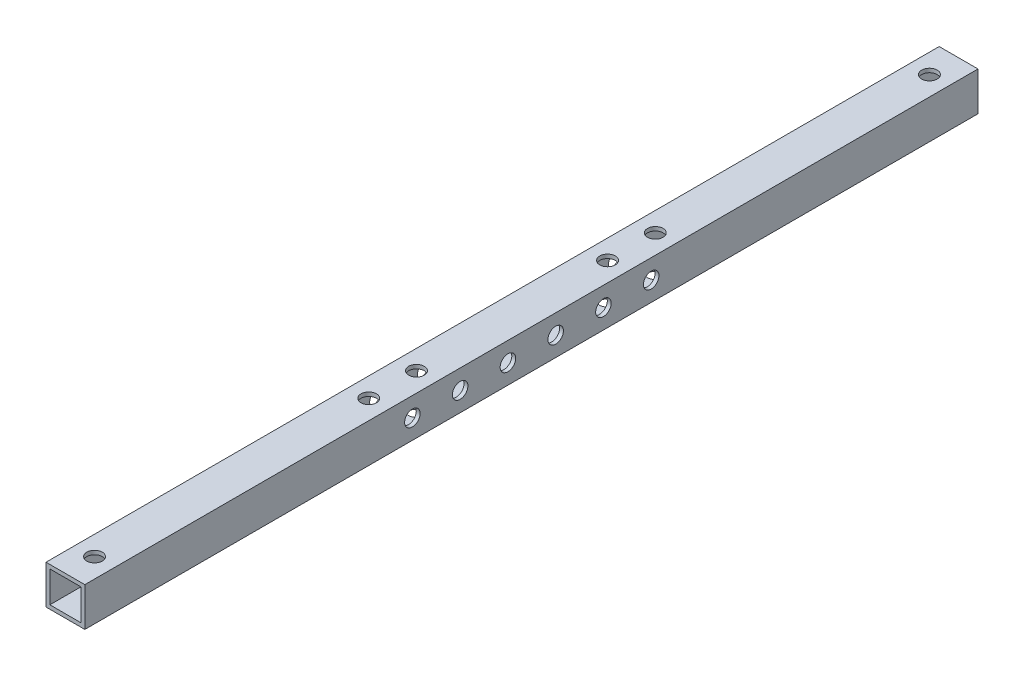
ISO-10303-21;
HEADER;
FILE_DESCRIPTION(('STEP AP214'),'2;1');
FILE_NAME('part.step','',(''),(''),'','','');
FILE_SCHEMA(('AUTOMOTIVE_DESIGN { 1 0 10303 214 1 1 1 1 }'));
ENDSEC;
DATA;
#1=APPLICATION_CONTEXT('core data for automotive mechanical design processes');
#2=APPLICATION_PROTOCOL_DEFINITION('international standard','automotive_design',2000,#1);
#3=PRODUCT_CONTEXT('',#1,'mechanical');
#4=PRODUCT('Part','Part','',(#3));
#5=PRODUCT_RELATED_PRODUCT_CATEGORY('part','',(#4));
#6=PRODUCT_DEFINITION_FORMATION('','',#4);
#7=PRODUCT_DEFINITION_CONTEXT('part definition',#1,'design');
#8=PRODUCT_DEFINITION('design','',#6,#7);
#9=PRODUCT_DEFINITION_SHAPE('','',#8);
#10=(LENGTH_UNIT() NAMED_UNIT(*) SI_UNIT(.MILLI.,.METRE.));
#11=(NAMED_UNIT(*) PLANE_ANGLE_UNIT() SI_UNIT($,.RADIAN.));
#12=(NAMED_UNIT(*) SI_UNIT($,.STERADIAN.) SOLID_ANGLE_UNIT());
#13=UNCERTAINTY_MEASURE_WITH_UNIT(LENGTH_MEASURE(1.E-05),#10,'distance_accuracy_value','');
#14=(GEOMETRIC_REPRESENTATION_CONTEXT(3) GLOBAL_UNCERTAINTY_ASSIGNED_CONTEXT((#13)) GLOBAL_UNIT_ASSIGNED_CONTEXT((#10,
#11,#12)) REPRESENTATION_CONTEXT('',''));
#15=CARTESIAN_POINT('',(0.,0.,0.));
#16=DIRECTION('',(0.,0.,1.));
#17=DIRECTION('',(1.,0.,0.));
#18=AXIS2_PLACEMENT_3D('',#15,#16,#17);
#19=CARTESIAN_POINT('',(-10.,10.,460.04));
#20=DIRECTION('',(0.,-1.,0.));
#21=DIRECTION('',(0.,0.,-1.));
#22=AXIS2_PLACEMENT_3D('',#19,#20,#21);
#23=PLANE('',#22);
#24=CARTESIAN_POINT('',(0.,10.,156.22));
#25=DIRECTION('',(0.,-1.,0.));
#26=DIRECTION('',(0.,0.,-1.));
#27=AXIS2_PLACEMENT_3D('',#24,#25,#26);
#28=CIRCLE('',#27,4.);
#29=CARTESIAN_POINT('',(0.,10.,152.22));
#30=VERTEX_POINT('',#29);
#31=EDGE_CURVE('E251',#30,#30,#28,.T.);
#32=ORIENTED_EDGE('',*,*,#31,.T.);
#33=EDGE_LOOP('',(#32));
#34=FACE_BOUND('',#33,.T.);
#35=CARTESIAN_POINT('',(0.,10.,279.22));
#36=DIRECTION('',(0.,1.,0.));
#37=DIRECTION('',(0.,0.,1.));
#38=AXIS2_PLACEMENT_3D('',#35,#36,#37);
#39=CIRCLE('',#38,4.);
#40=CARTESIAN_POINT('',(0.,10.,283.22));
#41=VERTEX_POINT('',#40);
#42=EDGE_CURVE('E248',#41,#41,#39,.T.);
#43=ORIENTED_EDGE('',*,*,#42,.F.);
#44=EDGE_LOOP('',(#43));
#45=FACE_BOUND('',#44,.T.);
#46=CARTESIAN_POINT('',(0.,10.,303.82));
#47=DIRECTION('',(0.,1.,0.));
#48=DIRECTION('',(0.,0.,1.));
#49=AXIS2_PLACEMENT_3D('',#46,#47,#48);
#50=CIRCLE('',#49,4.);
#51=CARTESIAN_POINT('',(0.,10.,307.82));
#52=VERTEX_POINT('',#51);
#53=EDGE_CURVE('E267',#52,#52,#50,.T.);
#54=ORIENTED_EDGE('',*,*,#53,.F.);
#55=EDGE_LOOP('',(#54));
#56=FACE_BOUND('',#55,.T.);
#57=DIRECTION('',(-1.,0.,0.));
#58=VECTOR('',#57,1.);
#59=CARTESIAN_POINT('',(-10.,10.,0.));
#60=LINE('',#59,#58);
#61=CARTESIAN_POINT('',(10.,10.,0.));
#62=VERTEX_POINT('',#61);
#63=CARTESIAN_POINT('',(-10.,10.,0.));
#64=VERTEX_POINT('',#63);
#65=EDGE_CURVE('E158',#62,#64,#60,.T.);
#66=ORIENTED_EDGE('',*,*,#65,.T.);
#67=DIRECTION('',(0.,0.,-1.));
#68=VECTOR('',#67,1.);
#69=CARTESIAN_POINT('',(-10.,10.,460.04));
#70=LINE('',#69,#68);
#71=CARTESIAN_POINT('',(-10.,10.,460.04));
#72=VERTEX_POINT('',#71);
#73=EDGE_CURVE('E168',#72,#64,#70,.T.);
#74=ORIENTED_EDGE('',*,*,#73,.F.);
#75=DIRECTION('',(-1.,0.,0.));
#76=VECTOR('',#75,1.);
#77=CARTESIAN_POINT('',(-10.,10.,460.04));
#78=LINE('',#77,#76);
#79=CARTESIAN_POINT('',(10.,10.,460.04));
#80=VERTEX_POINT('',#79);
#81=EDGE_CURVE('E148',#80,#72,#78,.T.);
#82=ORIENTED_EDGE('',*,*,#81,.F.);
#83=DIRECTION('',(0.,0.,-1.));
#84=VECTOR('',#83,1.);
#85=CARTESIAN_POINT('',(10.,10.,460.04));
#86=LINE('',#85,#84);
#87=EDGE_CURVE('E171',#80,#62,#86,.T.);
#88=ORIENTED_EDGE('',*,*,#87,.T.);
#89=EDGE_LOOP('',(#66,#74,#82,#88));
#90=FACE_BOUND('',#89,.T.);
#91=CARTESIAN_POINT('',(0.,10.,15.));
#92=DIRECTION('',(0.,1.,0.));
#93=DIRECTION('',(0.,0.,1.));
#94=AXIS2_PLACEMENT_3D('',#91,#92,#93);
#95=CIRCLE('',#94,4.);
#96=CARTESIAN_POINT('',(0.,10.,19.));
#97=VERTEX_POINT('',#96);
#98=EDGE_CURVE('E300',#97,#97,#95,.T.);
#99=ORIENTED_EDGE('',*,*,#98,.F.);
#100=EDGE_LOOP('',(#99));
#101=FACE_BOUND('',#100,.T.);
#102=CARTESIAN_POINT('',(0.,10.,445.04));
#103=DIRECTION('',(0.,-1.,0.));
#104=DIRECTION('',(0.,0.,-1.));
#105=AXIS2_PLACEMENT_3D('',#102,#103,#104);
#106=CIRCLE('',#105,4.);
#107=CARTESIAN_POINT('',(0.,10.,441.04));
#108=VERTEX_POINT('',#107);
#109=EDGE_CURVE('E293',#108,#108,#106,.T.);
#110=ORIENTED_EDGE('',*,*,#109,.T.);
#111=EDGE_LOOP('',(#110));
#112=FACE_BOUND('',#111,.T.);
#113=CARTESIAN_POINT('',(0.,10.,180.82));
#114=DIRECTION('',(0.,-1.,0.));
#115=DIRECTION('',(0.,0.,-1.));
#116=AXIS2_PLACEMENT_3D('',#113,#114,#115);
#117=CIRCLE('',#116,4.);
#118=CARTESIAN_POINT('',(0.,10.,176.82));
#119=VERTEX_POINT('',#118);
#120=EDGE_CURVE('E325',#119,#119,#117,.T.);
#121=ORIENTED_EDGE('',*,*,#120,.T.);
#122=EDGE_LOOP('',(#121));
#123=FACE_BOUND('',#122,.T.);
#124=ADVANCED_FACE('F37',(#34,#45,#56,#90,#101,#112,#123),#23,.F.);
#125=CARTESIAN_POINT('',(-10.,-10.,460.04));
#126=DIRECTION('',(0.,1.,0.));
#127=DIRECTION('',(0.,0.,1.));
#128=AXIS2_PLACEMENT_3D('',#125,#126,#127);
#129=PLANE('',#128);
#130=CARTESIAN_POINT('',(0.,-10.,156.22));
#131=DIRECTION('',(0.,-1.,0.));
#132=DIRECTION('',(0.,0.,-1.));
#133=AXIS2_PLACEMENT_3D('',#130,#131,#132);
#134=CIRCLE('',#133,4.);
#135=CARTESIAN_POINT('',(0.,-10.,152.22));
#136=VERTEX_POINT('',#135);
#137=EDGE_CURVE('E244',#136,#136,#134,.T.);
#138=ORIENTED_EDGE('',*,*,#137,.F.);
#139=EDGE_LOOP('',(#138));
#140=FACE_BOUND('',#139,.T.);
#141=CARTESIAN_POINT('',(0.,-10.,279.22));
#142=DIRECTION('',(0.,1.,0.));
#143=DIRECTION('',(0.,0.,1.));
#144=AXIS2_PLACEMENT_3D('',#141,#142,#143);
#145=CIRCLE('',#144,4.);
#146=CARTESIAN_POINT('',(0.,-10.,283.22));
#147=VERTEX_POINT('',#146);
#148=EDGE_CURVE('E240',#147,#147,#145,.T.);
#149=ORIENTED_EDGE('',*,*,#148,.T.);
#150=EDGE_LOOP('',(#149));
#151=FACE_BOUND('',#150,.T.);
#152=CARTESIAN_POINT('',(0.,-10.,303.82));
#153=DIRECTION('',(0.,1.,0.));
#154=DIRECTION('',(0.,0.,1.));
#155=AXIS2_PLACEMENT_3D('',#152,#153,#154);
#156=CIRCLE('',#155,4.);
#157=CARTESIAN_POINT('',(0.,-10.,307.82));
#158=VERTEX_POINT('',#157);
#159=EDGE_CURVE('E236',#158,#158,#156,.T.);
#160=ORIENTED_EDGE('',*,*,#159,.T.);
#161=EDGE_LOOP('',(#160));
#162=FACE_BOUND('',#161,.T.);
#163=DIRECTION('',(1.,0.,0.));
#164=VECTOR('',#163,1.);
#165=CARTESIAN_POINT('',(-10.,-10.,0.));
#166=LINE('',#165,#164);
#167=CARTESIAN_POINT('',(-10.,-10.,0.));
#168=VERTEX_POINT('',#167);
#169=CARTESIAN_POINT('',(10.,-10.,0.));
#170=VERTEX_POINT('',#169);
#171=EDGE_CURVE('E149',#168,#170,#166,.T.);
#172=ORIENTED_EDGE('',*,*,#171,.T.);
#173=DIRECTION('',(0.,0.,-1.));
#174=VECTOR('',#173,1.);
#175=CARTESIAN_POINT('',(10.,-10.,460.04));
#176=LINE('',#175,#174);
#177=CARTESIAN_POINT('',(10.,-10.,460.04));
#178=VERTEX_POINT('',#177);
#179=EDGE_CURVE('E155',#178,#170,#176,.T.);
#180=ORIENTED_EDGE('',*,*,#179,.F.);
#181=DIRECTION('',(1.,0.,0.));
#182=VECTOR('',#181,1.);
#183=CARTESIAN_POINT('',(-10.,-10.,460.04));
#184=LINE('',#183,#182);
#185=CARTESIAN_POINT('',(-10.,-10.,460.04));
#186=VERTEX_POINT('',#185);
#187=EDGE_CURVE('E153',#186,#178,#184,.T.);
#188=ORIENTED_EDGE('',*,*,#187,.F.);
#189=DIRECTION('',(0.,0.,-1.));
#190=VECTOR('',#189,1.);
#191=CARTESIAN_POINT('',(-10.,-10.,460.04));
#192=LINE('',#191,#190);
#193=EDGE_CURVE('E165',#186,#168,#192,.T.);
#194=ORIENTED_EDGE('',*,*,#193,.T.);
#195=EDGE_LOOP('',(#172,#180,#188,#194));
#196=FACE_BOUND('',#195,.T.);
#197=CARTESIAN_POINT('',(0.,-10.,15.));
#198=DIRECTION('',(0.,1.,0.));
#199=DIRECTION('',(0.,0.,1.));
#200=AXIS2_PLACEMENT_3D('',#197,#198,#199);
#201=CIRCLE('',#200,4.);
#202=CARTESIAN_POINT('',(0.,-10.,19.));
#203=VERTEX_POINT('',#202);
#204=EDGE_CURVE('E178',#203,#203,#201,.T.);
#205=ORIENTED_EDGE('',*,*,#204,.T.);
#206=EDGE_LOOP('',(#205));
#207=FACE_BOUND('',#206,.T.);
#208=CARTESIAN_POINT('',(0.,-10.,445.04));
#209=DIRECTION('',(0.,-1.,0.));
#210=DIRECTION('',(0.,0.,-1.));
#211=AXIS2_PLACEMENT_3D('',#208,#209,#210);
#212=CIRCLE('',#211,4.);
#213=CARTESIAN_POINT('',(0.,-10.,441.04));
#214=VERTEX_POINT('',#213);
#215=EDGE_CURVE('E183',#214,#214,#212,.T.);
#216=ORIENTED_EDGE('',*,*,#215,.F.);
#217=EDGE_LOOP('',(#216));
#218=FACE_BOUND('',#217,.T.);
#219=CARTESIAN_POINT('',(0.,-10.,180.82));
#220=DIRECTION('',(0.,-1.,0.));
#221=DIRECTION('',(0.,0.,-1.));
#222=AXIS2_PLACEMENT_3D('',#219,#220,#221);
#223=CIRCLE('',#222,4.);
#224=CARTESIAN_POINT('',(0.,-10.,176.82));
#225=VERTEX_POINT('',#224);
#226=EDGE_CURVE('E321',#225,#225,#223,.T.);
#227=ORIENTED_EDGE('',*,*,#226,.F.);
#228=EDGE_LOOP('',(#227));
#229=FACE_BOUND('',#228,.T.);
#230=ADVANCED_FACE('F312',(#140,#151,#162,#196,#207,#218,#229),#129,.F.);
#231=CARTESIAN_POINT('',(-8.,8.,460.04));
#232=DIRECTION('',(0.,-1.,0.));
#233=DIRECTION('',(0.,0.,-1.));
#234=AXIS2_PLACEMENT_3D('',#231,#232,#233);
#235=PLANE('',#234);
#236=CARTESIAN_POINT('',(0.,8.,156.22));
#237=DIRECTION('',(0.,-1.,0.));
#238=DIRECTION('',(0.,0.,-1.));
#239=AXIS2_PLACEMENT_3D('',#236,#237,#238);
#240=CIRCLE('',#239,4.);
#241=CARTESIAN_POINT('',(0.,8.,152.22));
#242=VERTEX_POINT('',#241);
#243=EDGE_CURVE('E243',#242,#242,#240,.F.);
#244=ORIENTED_EDGE('',*,*,#243,.T.);
#245=EDGE_LOOP('',(#244));
#246=FACE_BOUND('',#245,.T.);
#247=CARTESIAN_POINT('',(0.,8.,279.22));
#248=DIRECTION('',(0.,-1.,0.));
#249=DIRECTION('',(0.,0.,-1.));
#250=AXIS2_PLACEMENT_3D('',#247,#248,#249);
#251=CIRCLE('',#250,4.);
#252=CARTESIAN_POINT('',(0.,8.,275.22));
#253=VERTEX_POINT('',#252);
#254=EDGE_CURVE('E239',#253,#253,#251,.T.);
#255=ORIENTED_EDGE('',*,*,#254,.F.);
#256=EDGE_LOOP('',(#255));
#257=FACE_BOUND('',#256,.T.);
#258=CARTESIAN_POINT('',(0.,8.,303.82));
#259=DIRECTION('',(0.,-1.,0.));
#260=DIRECTION('',(0.,0.,-1.));
#261=AXIS2_PLACEMENT_3D('',#258,#259,#260);
#262=CIRCLE('',#261,4.);
#263=CARTESIAN_POINT('',(0.,8.,299.82));
#264=VERTEX_POINT('',#263);
#265=EDGE_CURVE('E235',#264,#264,#262,.T.);
#266=ORIENTED_EDGE('',*,*,#265,.F.);
#267=EDGE_LOOP('',(#266));
#268=FACE_BOUND('',#267,.T.);
#269=DIRECTION('',(-1.,0.,0.));
#270=VECTOR('',#269,1.);
#271=CARTESIAN_POINT('',(-8.,8.,0.));
#272=LINE('',#271,#270);
#273=CARTESIAN_POINT('',(8.,8.,0.));
#274=VERTEX_POINT('',#273);
#275=CARTESIAN_POINT('',(-8.,8.,0.));
#276=VERTEX_POINT('',#275);
#277=EDGE_CURVE('E121',#274,#276,#272,.T.);
#278=ORIENTED_EDGE('',*,*,#277,.F.);
#279=DIRECTION('',(0.,0.,-1.));
#280=VECTOR('',#279,1.);
#281=CARTESIAN_POINT('',(8.,8.,460.04));
#282=LINE('',#281,#280);
#283=CARTESIAN_POINT('',(8.,8.,460.04));
#284=VERTEX_POINT('',#283);
#285=EDGE_CURVE('E108',#284,#274,#282,.T.);
#286=ORIENTED_EDGE('',*,*,#285,.F.);
#287=DIRECTION('',(-1.,0.,0.));
#288=VECTOR('',#287,1.);
#289=CARTESIAN_POINT('',(-8.,8.,460.04));
#290=LINE('',#289,#288);
#291=CARTESIAN_POINT('',(-8.,8.,460.04));
#292=VERTEX_POINT('',#291);
#293=EDGE_CURVE('E113',#284,#292,#290,.T.);
#294=ORIENTED_EDGE('',*,*,#293,.T.);
#295=DIRECTION('',(0.,0.,-1.));
#296=VECTOR('',#295,1.);
#297=CARTESIAN_POINT('',(-8.,8.,460.04));
#298=LINE('',#297,#296);
#299=EDGE_CURVE('E123',#292,#276,#298,.T.);
#300=ORIENTED_EDGE('',*,*,#299,.T.);
#301=EDGE_LOOP('',(#278,#286,#294,#300));
#302=FACE_BOUND('',#301,.T.);
#303=CARTESIAN_POINT('',(0.,8.,15.));
#304=DIRECTION('',(0.,-1.,0.));
#305=DIRECTION('',(0.,0.,-1.));
#306=AXIS2_PLACEMENT_3D('',#303,#304,#305);
#307=CIRCLE('',#306,4.);
#308=CARTESIAN_POINT('',(0.,8.,11.));
#309=VERTEX_POINT('',#308);
#310=EDGE_CURVE('E135',#309,#309,#307,.T.);
#311=ORIENTED_EDGE('',*,*,#310,.F.);
#312=EDGE_LOOP('',(#311));
#313=FACE_BOUND('',#312,.T.);
#314=CARTESIAN_POINT('',(0.,8.,445.04));
#315=DIRECTION('',(0.,-1.,0.));
#316=DIRECTION('',(0.,0.,-1.));
#317=AXIS2_PLACEMENT_3D('',#314,#315,#316);
#318=CIRCLE('',#317,4.);
#319=CARTESIAN_POINT('',(0.,8.,441.04));
#320=VERTEX_POINT('',#319);
#321=EDGE_CURVE('E182',#320,#320,#318,.F.);
#322=ORIENTED_EDGE('',*,*,#321,.T.);
#323=EDGE_LOOP('',(#322));
#324=FACE_BOUND('',#323,.T.);
#325=CARTESIAN_POINT('',(0.,8.,180.82));
#326=DIRECTION('',(0.,-1.,0.));
#327=DIRECTION('',(0.,0.,-1.));
#328=AXIS2_PLACEMENT_3D('',#325,#326,#327);
#329=CIRCLE('',#328,4.);
#330=CARTESIAN_POINT('',(0.,8.,176.82));
#331=VERTEX_POINT('',#330);
#332=EDGE_CURVE('E256',#331,#331,#329,.F.);
#333=ORIENTED_EDGE('',*,*,#332,.T.);
#334=EDGE_LOOP('',(#333));
#335=FACE_BOUND('',#334,.T.);
#336=ADVANCED_FACE('F117',(#246,#257,#268,#302,#313,#324,#335),#235,.T.);
#337=CARTESIAN_POINT('',(-8.,-8.,460.04));
#338=DIRECTION('',(0.,1.,0.));
#339=DIRECTION('',(0.,0.,1.));
#340=AXIS2_PLACEMENT_3D('',#337,#338,#339);
#341=PLANE('',#340);
#342=CARTESIAN_POINT('',(0.,-8.,156.22));
#343=DIRECTION('',(0.,1.,0.));
#344=DIRECTION('',(0.,0.,1.));
#345=AXIS2_PLACEMENT_3D('',#342,#343,#344);
#346=CIRCLE('',#345,4.);
#347=CARTESIAN_POINT('',(0.,-8.,160.22));
#348=VERTEX_POINT('',#347);
#349=EDGE_CURVE('E241',#348,#348,#346,.F.);
#350=ORIENTED_EDGE('',*,*,#349,.T.);
#351=EDGE_LOOP('',(#350));
#352=FACE_BOUND('',#351,.T.);
#353=CARTESIAN_POINT('',(0.,-8.,279.22));
#354=DIRECTION('',(0.,1.,0.));
#355=DIRECTION('',(0.,0.,1.));
#356=AXIS2_PLACEMENT_3D('',#353,#354,#355);
#357=CIRCLE('',#356,4.);
#358=CARTESIAN_POINT('',(0.,-8.,283.22));
#359=VERTEX_POINT('',#358);
#360=EDGE_CURVE('E237',#359,#359,#357,.T.);
#361=ORIENTED_EDGE('',*,*,#360,.F.);
#362=EDGE_LOOP('',(#361));
#363=FACE_BOUND('',#362,.T.);
#364=CARTESIAN_POINT('',(0.,-8.,303.82));
#365=DIRECTION('',(0.,1.,0.));
#366=DIRECTION('',(0.,0.,1.));
#367=AXIS2_PLACEMENT_3D('',#364,#365,#366);
#368=CIRCLE('',#367,4.);
#369=CARTESIAN_POINT('',(0.,-8.,307.82));
#370=VERTEX_POINT('',#369);
#371=EDGE_CURVE('E232',#370,#370,#368,.T.);
#372=ORIENTED_EDGE('',*,*,#371,.F.);
#373=EDGE_LOOP('',(#372));
#374=FACE_BOUND('',#373,.T.);
#375=DIRECTION('',(1.,0.,0.));
#376=VECTOR('',#375,1.);
#377=CARTESIAN_POINT('',(-8.,-8.,0.));
#378=LINE('',#377,#376);
#379=CARTESIAN_POINT('',(-8.,-8.,0.));
#380=VERTEX_POINT('',#379);
#381=CARTESIAN_POINT('',(8.,-8.,0.));
#382=VERTEX_POINT('',#381);
#383=EDGE_CURVE('E114',#380,#382,#378,.T.);
#384=ORIENTED_EDGE('',*,*,#383,.F.);
#385=DIRECTION('',(0.,0.,-1.));
#386=VECTOR('',#385,1.);
#387=CARTESIAN_POINT('',(-8.,-8.,460.04));
#388=LINE('',#387,#386);
#389=CARTESIAN_POINT('',(-8.,-8.,460.04));
#390=VERTEX_POINT('',#389);
#391=EDGE_CURVE('E54',#390,#380,#388,.T.);
#392=ORIENTED_EDGE('',*,*,#391,.F.);
#393=DIRECTION('',(1.,0.,0.));
#394=VECTOR('',#393,1.);
#395=CARTESIAN_POINT('',(-8.,-8.,460.04));
#396=LINE('',#395,#394);
#397=CARTESIAN_POINT('',(8.,-8.,460.04));
#398=VERTEX_POINT('',#397);
#399=EDGE_CURVE('E129',#390,#398,#396,.T.);
#400=ORIENTED_EDGE('',*,*,#399,.T.);
#401=DIRECTION('',(0.,0.,-1.));
#402=VECTOR('',#401,1.);
#403=CARTESIAN_POINT('',(8.,-8.,460.04));
#404=LINE('',#403,#402);
#405=EDGE_CURVE('E109',#398,#382,#404,.T.);
#406=ORIENTED_EDGE('',*,*,#405,.T.);
#407=EDGE_LOOP('',(#384,#392,#400,#406));
#408=FACE_BOUND('',#407,.T.);
#409=CARTESIAN_POINT('',(0.,-8.,15.));
#410=DIRECTION('',(0.,1.,0.));
#411=DIRECTION('',(0.,0.,1.));
#412=AXIS2_PLACEMENT_3D('',#409,#410,#411);
#413=CIRCLE('',#412,4.);
#414=CARTESIAN_POINT('',(0.,-8.,19.));
#415=VERTEX_POINT('',#414);
#416=EDGE_CURVE('E175',#415,#415,#413,.T.);
#417=ORIENTED_EDGE('',*,*,#416,.F.);
#418=EDGE_LOOP('',(#417));
#419=FACE_BOUND('',#418,.T.);
#420=CARTESIAN_POINT('',(0.,-8.,445.04));
#421=DIRECTION('',(0.,1.,0.));
#422=DIRECTION('',(0.,0.,1.));
#423=AXIS2_PLACEMENT_3D('',#420,#421,#422);
#424=CIRCLE('',#423,4.);
#425=CARTESIAN_POINT('',(0.,-8.,449.04));
#426=VERTEX_POINT('',#425);
#427=EDGE_CURVE('E179',#426,#426,#424,.F.);
#428=ORIENTED_EDGE('',*,*,#427,.T.);
#429=EDGE_LOOP('',(#428));
#430=FACE_BOUND('',#429,.T.);
#431=CARTESIAN_POINT('',(0.,-8.,180.82));
#432=DIRECTION('',(0.,1.,0.));
#433=DIRECTION('',(0.,0.,1.));
#434=AXIS2_PLACEMENT_3D('',#431,#432,#433);
#435=CIRCLE('',#434,4.);
#436=CARTESIAN_POINT('',(0.,-8.,184.82));
#437=VERTEX_POINT('',#436);
#438=EDGE_CURVE('E41',#437,#437,#435,.F.);
#439=ORIENTED_EDGE('',*,*,#438,.T.);
#440=EDGE_LOOP('',(#439));
#441=FACE_BOUND('',#440,.T.);
#442=ADVANCED_FACE('F311',(#352,#363,#374,#408,#419,#430,#441),#341,.T.);
#443=CARTESIAN_POINT('',(0.,0.,460.04));
#444=DIRECTION('',(0.,0.,1.));
#445=DIRECTION('',(1.,0.,0.));
#446=AXIS2_PLACEMENT_3D('',#443,#444,#445);
#447=PLANE('',#446);
#448=DIRECTION('',(0.,1.,0.));
#449=VECTOR('',#448,1.);
#450=CARTESIAN_POINT('',(10.,10.,460.04));
#451=LINE('',#450,#449);
#452=EDGE_CURVE('E145',#178,#80,#451,.T.);
#453=ORIENTED_EDGE('',*,*,#452,.T.);
#454=ORIENTED_EDGE('',*,*,#81,.T.);
#455=DIRECTION('',(0.,-1.,0.));
#456=VECTOR('',#455,1.);
#457=CARTESIAN_POINT('',(-10.,10.,460.04));
#458=LINE('',#457,#456);
#459=EDGE_CURVE('E151',#72,#186,#458,.T.);
#460=ORIENTED_EDGE('',*,*,#459,.T.);
#461=ORIENTED_EDGE('',*,*,#187,.T.);
#462=EDGE_LOOP('',(#453,#454,#460,#461));
#463=FACE_BOUND('',#462,.T.);
#464=ORIENTED_EDGE('',*,*,#293,.F.);
#465=DIRECTION('',(0.,1.,0.));
#466=VECTOR('',#465,1.);
#467=CARTESIAN_POINT('',(8.,8.,460.04));
#468=LINE('',#467,#466);
#469=EDGE_CURVE('E104',#398,#284,#468,.T.);
#470=ORIENTED_EDGE('',*,*,#469,.F.);
#471=ORIENTED_EDGE('',*,*,#399,.F.);
#472=DIRECTION('',(0.,-1.,0.));
#473=VECTOR('',#472,1.);
#474=CARTESIAN_POINT('',(-8.,8.,460.04));
#475=LINE('',#474,#473);
#476=EDGE_CURVE('E127',#292,#390,#475,.T.);
#477=ORIENTED_EDGE('',*,*,#476,.F.);
#478=EDGE_LOOP('',(#464,#470,#471,#477));
#479=FACE_BOUND('',#478,.T.);
#480=ADVANCED_FACE('F126',(#463,#479),#447,.T.);
#481=CARTESIAN_POINT('',(0.,0.,0.));
#482=DIRECTION('',(0.,0.,1.));
#483=DIRECTION('',(1.,0.,0.));
#484=AXIS2_PLACEMENT_3D('',#481,#482,#483);
#485=PLANE('',#484);
#486=DIRECTION('',(0.,1.,0.));
#487=VECTOR('',#486,1.);
#488=CARTESIAN_POINT('',(10.,10.,0.));
#489=LINE('',#488,#487);
#490=EDGE_CURVE('E122',#170,#62,#489,.T.);
#491=ORIENTED_EDGE('',*,*,#490,.F.);
#492=ORIENTED_EDGE('',*,*,#171,.F.);
#493=DIRECTION('',(0.,-1.,0.));
#494=VECTOR('',#493,1.);
#495=CARTESIAN_POINT('',(-10.,10.,0.));
#496=LINE('',#495,#494);
#497=EDGE_CURVE('E160',#64,#168,#496,.T.);
#498=ORIENTED_EDGE('',*,*,#497,.F.);
#499=ORIENTED_EDGE('',*,*,#65,.F.);
#500=EDGE_LOOP('',(#491,#492,#498,#499));
#501=FACE_BOUND('',#500,.T.);
#502=DIRECTION('',(0.,1.,0.));
#503=VECTOR('',#502,1.);
#504=CARTESIAN_POINT('',(8.,8.,0.));
#505=LINE('',#504,#503);
#506=EDGE_CURVE('E62',#382,#274,#505,.T.);
#507=ORIENTED_EDGE('',*,*,#506,.T.);
#508=ORIENTED_EDGE('',*,*,#277,.T.);
#509=DIRECTION('',(0.,-1.,0.));
#510=VECTOR('',#509,1.);
#511=CARTESIAN_POINT('',(-8.,8.,0.));
#512=LINE('',#511,#510);
#513=EDGE_CURVE('E137',#276,#380,#512,.T.);
#514=ORIENTED_EDGE('',*,*,#513,.T.);
#515=ORIENTED_EDGE('',*,*,#383,.T.);
#516=EDGE_LOOP('',(#507,#508,#514,#515));
#517=FACE_BOUND('',#516,.T.);
#518=ADVANCED_FACE('F359',(#501,#517),#485,.F.);
#519=CARTESIAN_POINT('',(10.,10.,460.04));
#520=DIRECTION('',(-1.,0.,0.));
#521=DIRECTION('',(0.,-1.,0.));
#522=AXIS2_PLACEMENT_3D('',#519,#520,#521);
#523=PLANE('',#522);
#524=CARTESIAN_POINT('',(10.,0.,266.73));
#525=DIRECTION('',(1.,0.,0.));
#526=DIRECTION('',(0.,1.,0.));
#527=AXIS2_PLACEMENT_3D('',#524,#525,#526);
#528=CIRCLE('',#527,3.99999999999999);
#529=CARTESIAN_POINT('',(10.,3.99999999999999,266.73));
#530=VERTEX_POINT('',#529);
#531=EDGE_CURVE('E283',#530,#530,#528,.T.);
#532=ORIENTED_EDGE('',*,*,#531,.F.);
#533=EDGE_LOOP('',(#532));
#534=FACE_BOUND('',#533,.T.);
#535=CARTESIAN_POINT('',(10.,0.,291.33));
#536=DIRECTION('',(1.,0.,0.));
#537=DIRECTION('',(0.,1.,0.));
#538=AXIS2_PLACEMENT_3D('',#535,#536,#537);
#539=CIRCLE('',#538,3.99999999999999);
#540=CARTESIAN_POINT('',(10.,3.99999999999999,291.33));
#541=VERTEX_POINT('',#540);
#542=EDGE_CURVE('E286',#541,#541,#539,.T.);
#543=ORIENTED_EDGE('',*,*,#542,.F.);
#544=EDGE_LOOP('',(#543));
#545=FACE_BOUND('',#544,.T.);
#546=ORIENTED_EDGE('',*,*,#490,.T.);
#547=ORIENTED_EDGE('',*,*,#87,.F.);
#548=ORIENTED_EDGE('',*,*,#452,.F.);
#549=ORIENTED_EDGE('',*,*,#179,.T.);
#550=EDGE_LOOP('',(#546,#547,#548,#549));
#551=FACE_BOUND('',#550,.T.);
#552=CARTESIAN_POINT('',(10.,0.,242.13));
#553=DIRECTION('',(1.,0.,0.));
#554=DIRECTION('',(0.,1.,0.));
#555=AXIS2_PLACEMENT_3D('',#552,#553,#554);
#556=CIRCLE('',#555,3.99999999999999);
#557=CARTESIAN_POINT('',(10.,3.99999999999999,242.13));
#558=VERTEX_POINT('',#557);
#559=EDGE_CURVE('E191',#558,#558,#556,.T.);
#560=ORIENTED_EDGE('',*,*,#559,.F.);
#561=EDGE_LOOP('',(#560));
#562=FACE_BOUND('',#561,.T.);
#563=CARTESIAN_POINT('',(10.,0.,217.53));
#564=DIRECTION('',(1.,0.,0.));
#565=DIRECTION('',(0.,1.,0.));
#566=AXIS2_PLACEMENT_3D('',#563,#564,#565);
#567=CIRCLE('',#566,3.99999999999999);
#568=CARTESIAN_POINT('',(10.,3.99999999999999,217.53));
#569=VERTEX_POINT('',#568);
#570=EDGE_CURVE('E197',#569,#569,#567,.T.);
#571=ORIENTED_EDGE('',*,*,#570,.F.);
#572=EDGE_LOOP('',(#571));
#573=FACE_BOUND('',#572,.T.);
#574=CARTESIAN_POINT('',(10.,0.,192.93));
#575=DIRECTION('',(1.,0.,0.));
#576=DIRECTION('',(0.,1.,0.));
#577=AXIS2_PLACEMENT_3D('',#574,#575,#576);
#578=CIRCLE('',#577,3.99999999999999);
#579=CARTESIAN_POINT('',(10.,3.99999999999999,192.93));
#580=VERTEX_POINT('',#579);
#581=EDGE_CURVE('E203',#580,#580,#578,.T.);
#582=ORIENTED_EDGE('',*,*,#581,.F.);
#583=EDGE_LOOP('',(#582));
#584=FACE_BOUND('',#583,.T.);
#585=CARTESIAN_POINT('',(10.,0.,168.33));
#586=DIRECTION('',(1.,0.,0.));
#587=DIRECTION('',(0.,1.,0.));
#588=AXIS2_PLACEMENT_3D('',#585,#586,#587);
#589=CIRCLE('',#588,3.99999999999999);
#590=CARTESIAN_POINT('',(10.,3.99999999999999,168.33));
#591=VERTEX_POINT('',#590);
#592=EDGE_CURVE('E209',#591,#591,#589,.T.);
#593=ORIENTED_EDGE('',*,*,#592,.F.);
#594=EDGE_LOOP('',(#593));
#595=FACE_BOUND('',#594,.T.);
#596=ADVANCED_FACE('F356',(#534,#545,#551,#562,#573,#584,#595),#523,.F.);
#597=CARTESIAN_POINT('',(-10.,10.,460.04));
#598=DIRECTION('',(1.,0.,0.));
#599=DIRECTION('',(0.,1.,0.));
#600=AXIS2_PLACEMENT_3D('',#597,#598,#599);
#601=PLANE('',#600);
#602=CARTESIAN_POINT('',(-10.,0.,266.73));
#603=DIRECTION('',(1.,0.,0.));
#604=DIRECTION('',(0.,1.,0.));
#605=AXIS2_PLACEMENT_3D('',#602,#603,#604);
#606=CIRCLE('',#605,3.99999999999999);
#607=CARTESIAN_POINT('',(-10.,3.99999999999999,266.73));
#608=VERTEX_POINT('',#607);
#609=EDGE_CURVE('E277',#608,#608,#606,.T.);
#610=ORIENTED_EDGE('',*,*,#609,.T.);
#611=EDGE_LOOP('',(#610));
#612=FACE_BOUND('',#611,.T.);
#613=CARTESIAN_POINT('',(-10.,0.,291.33));
#614=DIRECTION('',(1.,0.,0.));
#615=DIRECTION('',(0.,1.,0.));
#616=AXIS2_PLACEMENT_3D('',#613,#614,#615);
#617=CIRCLE('',#616,3.99999999999999);
#618=CARTESIAN_POINT('',(-10.,3.99999999999999,291.33));
#619=VERTEX_POINT('',#618);
#620=EDGE_CURVE('E188',#619,#619,#617,.T.);
#621=ORIENTED_EDGE('',*,*,#620,.T.);
#622=EDGE_LOOP('',(#621));
#623=FACE_BOUND('',#622,.T.);
#624=ORIENTED_EDGE('',*,*,#497,.T.);
#625=ORIENTED_EDGE('',*,*,#193,.F.);
#626=ORIENTED_EDGE('',*,*,#459,.F.);
#627=ORIENTED_EDGE('',*,*,#73,.T.);
#628=EDGE_LOOP('',(#624,#625,#626,#627));
#629=FACE_BOUND('',#628,.T.);
#630=CARTESIAN_POINT('',(-10.,0.,242.13));
#631=DIRECTION('',(1.,0.,0.));
#632=DIRECTION('',(0.,1.,0.));
#633=AXIS2_PLACEMENT_3D('',#630,#631,#632);
#634=CIRCLE('',#633,3.99999999999999);
#635=CARTESIAN_POINT('',(-10.,3.99999999999999,242.13));
#636=VERTEX_POINT('',#635);
#637=EDGE_CURVE('E215',#636,#636,#634,.T.);
#638=ORIENTED_EDGE('',*,*,#637,.T.);
#639=EDGE_LOOP('',(#638));
#640=FACE_BOUND('',#639,.T.);
#641=CARTESIAN_POINT('',(-10.,0.,217.53));
#642=DIRECTION('',(1.,0.,0.));
#643=DIRECTION('',(0.,1.,0.));
#644=AXIS2_PLACEMENT_3D('',#641,#642,#643);
#645=CIRCLE('',#644,3.99999999999999);
#646=CARTESIAN_POINT('',(-10.,3.99999999999999,217.53));
#647=VERTEX_POINT('',#646);
#648=EDGE_CURVE('E221',#647,#647,#645,.T.);
#649=ORIENTED_EDGE('',*,*,#648,.T.);
#650=EDGE_LOOP('',(#649));
#651=FACE_BOUND('',#650,.T.);
#652=CARTESIAN_POINT('',(-10.,0.,192.93));
#653=DIRECTION('',(1.,0.,0.));
#654=DIRECTION('',(0.,1.,0.));
#655=AXIS2_PLACEMENT_3D('',#652,#653,#654);
#656=CIRCLE('',#655,3.99999999999999);
#657=CARTESIAN_POINT('',(-10.,3.99999999999999,192.93));
#658=VERTEX_POINT('',#657);
#659=EDGE_CURVE('E227',#658,#658,#656,.T.);
#660=ORIENTED_EDGE('',*,*,#659,.T.);
#661=EDGE_LOOP('',(#660));
#662=FACE_BOUND('',#661,.T.);
#663=CARTESIAN_POINT('',(-10.,0.,168.33));
#664=DIRECTION('',(1.,0.,0.));
#665=DIRECTION('',(0.,1.,0.));
#666=AXIS2_PLACEMENT_3D('',#663,#664,#665);
#667=CIRCLE('',#666,3.99999999999999);
#668=CARTESIAN_POINT('',(-10.,3.99999999999999,168.33));
#669=VERTEX_POINT('',#668);
#670=EDGE_CURVE('E11',#669,#669,#667,.T.);
#671=ORIENTED_EDGE('',*,*,#670,.T.);
#672=EDGE_LOOP('',(#671));
#673=FACE_BOUND('',#672,.T.);
#674=ADVANCED_FACE('F355',(#612,#623,#629,#640,#651,#662,#673),#601,.F.);
#675=CARTESIAN_POINT('',(8.,8.,460.04));
#676=DIRECTION('',(-1.,0.,0.));
#677=DIRECTION('',(0.,-1.,0.));
#678=AXIS2_PLACEMENT_3D('',#675,#676,#677);
#679=PLANE('',#678);
#680=CARTESIAN_POINT('',(8.,0.,266.73));
#681=DIRECTION('',(-1.,0.,0.));
#682=DIRECTION('',(0.,-1.,0.));
#683=AXIS2_PLACEMENT_3D('',#680,#681,#682);
#684=CIRCLE('',#683,3.99999999999999);
#685=CARTESIAN_POINT('',(8.,-3.99999999999999,266.73));
#686=VERTEX_POINT('',#685);
#687=EDGE_CURVE('E280',#686,#686,#684,.T.);
#688=ORIENTED_EDGE('',*,*,#687,.F.);
#689=EDGE_LOOP('',(#688));
#690=FACE_BOUND('',#689,.T.);
#691=CARTESIAN_POINT('',(8.,0.,291.33));
#692=DIRECTION('',(-1.,0.,0.));
#693=DIRECTION('',(0.,-1.,0.));
#694=AXIS2_PLACEMENT_3D('',#691,#692,#693);
#695=CIRCLE('',#694,3.99999999999999);
#696=CARTESIAN_POINT('',(8.,-3.99999999999999,291.33));
#697=VERTEX_POINT('',#696);
#698=EDGE_CURVE('E187',#697,#697,#695,.T.);
#699=ORIENTED_EDGE('',*,*,#698,.F.);
#700=EDGE_LOOP('',(#699));
#701=FACE_BOUND('',#700,.T.);
#702=ORIENTED_EDGE('',*,*,#506,.F.);
#703=ORIENTED_EDGE('',*,*,#405,.F.);
#704=ORIENTED_EDGE('',*,*,#469,.T.);
#705=ORIENTED_EDGE('',*,*,#285,.T.);
#706=EDGE_LOOP('',(#702,#703,#704,#705));
#707=FACE_BOUND('',#706,.T.);
#708=CARTESIAN_POINT('',(8.,0.,242.13));
#709=DIRECTION('',(-1.,0.,0.));
#710=DIRECTION('',(0.,-1.,0.));
#711=AXIS2_PLACEMENT_3D('',#708,#709,#710);
#712=CIRCLE('',#711,3.99999999999999);
#713=CARTESIAN_POINT('',(8.,-3.99999999999999,242.13));
#714=VERTEX_POINT('',#713);
#715=EDGE_CURVE('E174',#714,#714,#712,.T.);
#716=ORIENTED_EDGE('',*,*,#715,.F.);
#717=EDGE_LOOP('',(#716));
#718=FACE_BOUND('',#717,.T.);
#719=CARTESIAN_POINT('',(8.,0.,217.53));
#720=DIRECTION('',(-1.,0.,0.));
#721=DIRECTION('',(0.,-1.,0.));
#722=AXIS2_PLACEMENT_3D('',#719,#720,#721);
#723=CIRCLE('',#722,3.99999999999999);
#724=CARTESIAN_POINT('',(8.,-3.99999999999999,217.53));
#725=VERTEX_POINT('',#724);
#726=EDGE_CURVE('E194',#725,#725,#723,.T.);
#727=ORIENTED_EDGE('',*,*,#726,.F.);
#728=EDGE_LOOP('',(#727));
#729=FACE_BOUND('',#728,.T.);
#730=CARTESIAN_POINT('',(8.,0.,192.93));
#731=DIRECTION('',(-1.,0.,0.));
#732=DIRECTION('',(0.,-1.,0.));
#733=AXIS2_PLACEMENT_3D('',#730,#731,#732);
#734=CIRCLE('',#733,3.99999999999999);
#735=CARTESIAN_POINT('',(8.,-3.99999999999999,192.93));
#736=VERTEX_POINT('',#735);
#737=EDGE_CURVE('E200',#736,#736,#734,.T.);
#738=ORIENTED_EDGE('',*,*,#737,.F.);
#739=EDGE_LOOP('',(#738));
#740=FACE_BOUND('',#739,.T.);
#741=CARTESIAN_POINT('',(8.,0.,168.33));
#742=DIRECTION('',(-1.,0.,0.));
#743=DIRECTION('',(0.,-1.,0.));
#744=AXIS2_PLACEMENT_3D('',#741,#742,#743);
#745=CIRCLE('',#744,3.99999999999999);
#746=CARTESIAN_POINT('',(8.,-3.99999999999999,168.33));
#747=VERTEX_POINT('',#746);
#748=EDGE_CURVE('E206',#747,#747,#745,.T.);
#749=ORIENTED_EDGE('',*,*,#748,.F.);
#750=EDGE_LOOP('',(#749));
#751=FACE_BOUND('',#750,.T.);
#752=ADVANCED_FACE('F106',(#690,#701,#707,#718,#729,#740,#751),#679,.T.);
#753=CARTESIAN_POINT('',(-8.,8.,460.04));
#754=DIRECTION('',(1.,0.,0.));
#755=DIRECTION('',(0.,1.,0.));
#756=AXIS2_PLACEMENT_3D('',#753,#754,#755);
#757=PLANE('',#756);
#758=CARTESIAN_POINT('',(-8.,0.,266.73));
#759=DIRECTION('',(1.,0.,0.));
#760=DIRECTION('',(0.,1.,0.));
#761=AXIS2_PLACEMENT_3D('',#758,#759,#760);
#762=CIRCLE('',#761,3.99999999999999);
#763=CARTESIAN_POINT('',(-8.,3.99999999999999,266.73));
#764=VERTEX_POINT('',#763);
#765=EDGE_CURVE('E274',#764,#764,#762,.T.);
#766=ORIENTED_EDGE('',*,*,#765,.F.);
#767=EDGE_LOOP('',(#766));
#768=FACE_BOUND('',#767,.T.);
#769=CARTESIAN_POINT('',(-8.,0.,291.33));
#770=DIRECTION('',(1.,0.,0.));
#771=DIRECTION('',(0.,1.,0.));
#772=AXIS2_PLACEMENT_3D('',#769,#770,#771);
#773=CIRCLE('',#772,3.99999999999999);
#774=CARTESIAN_POINT('',(-8.,3.99999999999999,291.33));
#775=VERTEX_POINT('',#774);
#776=EDGE_CURVE('E184',#775,#775,#773,.T.);
#777=ORIENTED_EDGE('',*,*,#776,.F.);
#778=EDGE_LOOP('',(#777));
#779=FACE_BOUND('',#778,.T.);
#780=ORIENTED_EDGE('',*,*,#513,.F.);
#781=ORIENTED_EDGE('',*,*,#299,.F.);
#782=ORIENTED_EDGE('',*,*,#476,.T.);
#783=ORIENTED_EDGE('',*,*,#391,.T.);
#784=EDGE_LOOP('',(#780,#781,#782,#783));
#785=FACE_BOUND('',#784,.T.);
#786=CARTESIAN_POINT('',(-8.,0.,242.13));
#787=DIRECTION('',(1.,0.,0.));
#788=DIRECTION('',(0.,1.,0.));
#789=AXIS2_PLACEMENT_3D('',#786,#787,#788);
#790=CIRCLE('',#789,3.99999999999999);
#791=CARTESIAN_POINT('',(-8.,3.99999999999999,242.13));
#792=VERTEX_POINT('',#791);
#793=EDGE_CURVE('E212',#792,#792,#790,.T.);
#794=ORIENTED_EDGE('',*,*,#793,.F.);
#795=EDGE_LOOP('',(#794));
#796=FACE_BOUND('',#795,.T.);
#797=CARTESIAN_POINT('',(-8.,0.,217.53));
#798=DIRECTION('',(1.,0.,0.));
#799=DIRECTION('',(0.,1.,0.));
#800=AXIS2_PLACEMENT_3D('',#797,#798,#799);
#801=CIRCLE('',#800,3.99999999999999);
#802=CARTESIAN_POINT('',(-8.,3.99999999999999,217.53));
#803=VERTEX_POINT('',#802);
#804=EDGE_CURVE('E218',#803,#803,#801,.T.);
#805=ORIENTED_EDGE('',*,*,#804,.F.);
#806=EDGE_LOOP('',(#805));
#807=FACE_BOUND('',#806,.T.);
#808=CARTESIAN_POINT('',(-8.,0.,192.93));
#809=DIRECTION('',(1.,0.,0.));
#810=DIRECTION('',(0.,1.,0.));
#811=AXIS2_PLACEMENT_3D('',#808,#809,#810);
#812=CIRCLE('',#811,3.99999999999999);
#813=CARTESIAN_POINT('',(-8.,3.99999999999999,192.93));
#814=VERTEX_POINT('',#813);
#815=EDGE_CURVE('E224',#814,#814,#812,.T.);
#816=ORIENTED_EDGE('',*,*,#815,.F.);
#817=EDGE_LOOP('',(#816));
#818=FACE_BOUND('',#817,.T.);
#819=CARTESIAN_POINT('',(-8.,0.,168.33));
#820=DIRECTION('',(1.,0.,0.));
#821=DIRECTION('',(0.,1.,0.));
#822=AXIS2_PLACEMENT_3D('',#819,#820,#821);
#823=CIRCLE('',#822,3.99999999999999);
#824=CARTESIAN_POINT('',(-8.,3.99999999999999,168.33));
#825=VERTEX_POINT('',#824);
#826=EDGE_CURVE('E46',#825,#825,#823,.T.);
#827=ORIENTED_EDGE('',*,*,#826,.F.);
#828=EDGE_LOOP('',(#827));
#829=FACE_BOUND('',#828,.T.);
#830=ADVANCED_FACE('F406',(#768,#779,#785,#796,#807,#818,#829),#757,.T.);
#831=CARTESIAN_POINT('',(0.,-10.,15.));
#832=DIRECTION('',(0.,1.,0.));
#833=DIRECTION('',(0.,0.,1.));
#834=AXIS2_PLACEMENT_3D('',#831,#832,#833);
#835=CYLINDRICAL_SURFACE('',#834,4.);
#836=ORIENTED_EDGE('',*,*,#416,.T.);
#837=EDGE_LOOP('',(#836));
#838=FACE_BOUND('',#837,.T.);
#839=ORIENTED_EDGE('',*,*,#204,.F.);
#840=EDGE_LOOP('',(#839));
#841=FACE_BOUND('',#840,.T.);
#842=ADVANCED_FACE('F458',(#838,#841),#835,.F.);
#843=ORIENTED_EDGE('',*,*,#310,.T.);
#844=EDGE_LOOP('',(#843));
#845=FACE_BOUND('',#844,.T.);
#846=ORIENTED_EDGE('',*,*,#98,.T.);
#847=EDGE_LOOP('',(#846));
#848=FACE_BOUND('',#847,.T.);
#849=ADVANCED_FACE('F307',(#845,#848),#835,.F.);
#850=CARTESIAN_POINT('',(0.,-10.,445.04));
#851=DIRECTION('',(0.,1.,0.));
#852=DIRECTION('',(0.,0.,1.));
#853=AXIS2_PLACEMENT_3D('',#850,#851,#852);
#854=CYLINDRICAL_SURFACE('',#853,4.);
#855=ORIENTED_EDGE('',*,*,#427,.F.);
#856=EDGE_LOOP('',(#855));
#857=FACE_BOUND('',#856,.T.);
#858=ORIENTED_EDGE('',*,*,#215,.T.);
#859=EDGE_LOOP('',(#858));
#860=FACE_BOUND('',#859,.T.);
#861=ADVANCED_FACE('F445',(#857,#860),#854,.F.);
#862=ORIENTED_EDGE('',*,*,#321,.F.);
#863=EDGE_LOOP('',(#862));
#864=FACE_BOUND('',#863,.T.);
#865=ORIENTED_EDGE('',*,*,#109,.F.);
#866=EDGE_LOOP('',(#865));
#867=FACE_BOUND('',#866,.T.);
#868=ADVANCED_FACE('F442',(#864,#867),#854,.F.);
#869=CARTESIAN_POINT('',(-10.,0.,291.33));
#870=DIRECTION('',(1.,0.,0.));
#871=DIRECTION('',(0.,1.,0.));
#872=AXIS2_PLACEMENT_3D('',#869,#870,#871);
#873=CYLINDRICAL_SURFACE('',#872,3.99999999999999);
#874=ORIENTED_EDGE('',*,*,#776,.T.);
#875=EDGE_LOOP('',(#874));
#876=FACE_BOUND('',#875,.T.);
#877=ORIENTED_EDGE('',*,*,#620,.F.);
#878=EDGE_LOOP('',(#877));
#879=FACE_BOUND('',#878,.T.);
#880=ADVANCED_FACE('F444',(#876,#879),#873,.F.);
#881=ORIENTED_EDGE('',*,*,#698,.T.);
#882=EDGE_LOOP('',(#881));
#883=FACE_BOUND('',#882,.T.);
#884=ORIENTED_EDGE('',*,*,#542,.T.);
#885=EDGE_LOOP('',(#884));
#886=FACE_BOUND('',#885,.T.);
#887=ADVANCED_FACE('F452',(#883,#886),#873,.F.);
#888=CARTESIAN_POINT('',(-10.,0.,266.73));
#889=DIRECTION('',(1.,0.,0.));
#890=DIRECTION('',(0.,1.,0.));
#891=AXIS2_PLACEMENT_3D('',#888,#889,#890);
#892=CYLINDRICAL_SURFACE('',#891,3.99999999999999);
#893=ORIENTED_EDGE('',*,*,#687,.T.);
#894=EDGE_LOOP('',(#893));
#895=FACE_BOUND('',#894,.T.);
#896=ORIENTED_EDGE('',*,*,#531,.T.);
#897=EDGE_LOOP('',(#896));
#898=FACE_BOUND('',#897,.T.);
#899=ADVANCED_FACE('F365',(#895,#898),#892,.F.);
#900=CARTESIAN_POINT('',(-10.,0.,242.13));
#901=DIRECTION('',(1.,0.,0.));
#902=DIRECTION('',(0.,1.,0.));
#903=AXIS2_PLACEMENT_3D('',#900,#901,#902);
#904=CYLINDRICAL_SURFACE('',#903,3.99999999999999);
#905=ORIENTED_EDGE('',*,*,#715,.T.);
#906=EDGE_LOOP('',(#905));
#907=FACE_BOUND('',#906,.T.);
#908=ORIENTED_EDGE('',*,*,#559,.T.);
#909=EDGE_LOOP('',(#908));
#910=FACE_BOUND('',#909,.T.);
#911=ADVANCED_FACE('F361',(#907,#910),#904,.F.);
#912=CARTESIAN_POINT('',(-10.,0.,217.53));
#913=DIRECTION('',(1.,0.,0.));
#914=DIRECTION('',(0.,1.,0.));
#915=AXIS2_PLACEMENT_3D('',#912,#913,#914);
#916=CYLINDRICAL_SURFACE('',#915,3.99999999999999);
#917=ORIENTED_EDGE('',*,*,#726,.T.);
#918=EDGE_LOOP('',(#917));
#919=FACE_BOUND('',#918,.T.);
#920=ORIENTED_EDGE('',*,*,#570,.T.);
#921=EDGE_LOOP('',(#920));
#922=FACE_BOUND('',#921,.T.);
#923=ADVANCED_FACE('F364',(#919,#922),#916,.F.);
#924=CARTESIAN_POINT('',(-10.,0.,192.93));
#925=DIRECTION('',(1.,0.,0.));
#926=DIRECTION('',(0.,1.,0.));
#927=AXIS2_PLACEMENT_3D('',#924,#925,#926);
#928=CYLINDRICAL_SURFACE('',#927,3.99999999999999);
#929=ORIENTED_EDGE('',*,*,#737,.T.);
#930=EDGE_LOOP('',(#929));
#931=FACE_BOUND('',#930,.T.);
#932=ORIENTED_EDGE('',*,*,#581,.T.);
#933=EDGE_LOOP('',(#932));
#934=FACE_BOUND('',#933,.T.);
#935=ADVANCED_FACE('F369',(#931,#934),#928,.F.);
#936=CARTESIAN_POINT('',(-10.,0.,168.33));
#937=DIRECTION('',(1.,0.,0.));
#938=DIRECTION('',(0.,1.,0.));
#939=AXIS2_PLACEMENT_3D('',#936,#937,#938);
#940=CYLINDRICAL_SURFACE('',#939,3.99999999999999);
#941=ORIENTED_EDGE('',*,*,#748,.T.);
#942=EDGE_LOOP('',(#941));
#943=FACE_BOUND('',#942,.T.);
#944=ORIENTED_EDGE('',*,*,#592,.T.);
#945=EDGE_LOOP('',(#944));
#946=FACE_BOUND('',#945,.T.);
#947=ADVANCED_FACE('F373',(#943,#946),#940,.F.);
#948=CARTESIAN_POINT('',(-10.,0.,266.73));
#949=DIRECTION('',(1.,0.,0.));
#950=DIRECTION('',(0.,1.,0.));
#951=AXIS2_PLACEMENT_3D('',#948,#949,#950);
#952=CYLINDRICAL_SURFACE('',#951,3.99999999999999);
#953=ORIENTED_EDGE('',*,*,#765,.T.);
#954=EDGE_LOOP('',(#953));
#955=FACE_BOUND('',#954,.T.);
#956=ORIENTED_EDGE('',*,*,#609,.F.);
#957=EDGE_LOOP('',(#956));
#958=FACE_BOUND('',#957,.T.);
#959=ADVANCED_FACE('F377',(#955,#958),#952,.F.);
#960=CARTESIAN_POINT('',(-10.,0.,242.13));
#961=DIRECTION('',(1.,0.,0.));
#962=DIRECTION('',(0.,1.,0.));
#963=AXIS2_PLACEMENT_3D('',#960,#961,#962);
#964=CYLINDRICAL_SURFACE('',#963,3.99999999999999);
#965=ORIENTED_EDGE('',*,*,#793,.T.);
#966=EDGE_LOOP('',(#965));
#967=FACE_BOUND('',#966,.T.);
#968=ORIENTED_EDGE('',*,*,#637,.F.);
#969=EDGE_LOOP('',(#968));
#970=FACE_BOUND('',#969,.T.);
#971=ADVANCED_FACE('F379',(#967,#970),#964,.F.);
#972=CARTESIAN_POINT('',(-10.,0.,217.53));
#973=DIRECTION('',(1.,0.,0.));
#974=DIRECTION('',(0.,1.,0.));
#975=AXIS2_PLACEMENT_3D('',#972,#973,#974);
#976=CYLINDRICAL_SURFACE('',#975,3.99999999999999);
#977=ORIENTED_EDGE('',*,*,#804,.T.);
#978=EDGE_LOOP('',(#977));
#979=FACE_BOUND('',#978,.T.);
#980=ORIENTED_EDGE('',*,*,#648,.F.);
#981=EDGE_LOOP('',(#980));
#982=FACE_BOUND('',#981,.T.);
#983=ADVANCED_FACE('F382',(#979,#982),#976,.F.);
#984=CARTESIAN_POINT('',(-10.,0.,192.93));
#985=DIRECTION('',(1.,0.,0.));
#986=DIRECTION('',(0.,1.,0.));
#987=AXIS2_PLACEMENT_3D('',#984,#985,#986);
#988=CYLINDRICAL_SURFACE('',#987,3.99999999999999);
#989=ORIENTED_EDGE('',*,*,#815,.T.);
#990=EDGE_LOOP('',(#989));
#991=FACE_BOUND('',#990,.T.);
#992=ORIENTED_EDGE('',*,*,#659,.F.);
#993=EDGE_LOOP('',(#992));
#994=FACE_BOUND('',#993,.T.);
#995=ADVANCED_FACE('F385',(#991,#994),#988,.F.);
#996=CARTESIAN_POINT('',(-10.,0.,168.33));
#997=DIRECTION('',(1.,0.,0.));
#998=DIRECTION('',(0.,1.,0.));
#999=AXIS2_PLACEMENT_3D('',#996,#997,#998);
#1000=CYLINDRICAL_SURFACE('',#999,3.99999999999999);
#1001=ORIENTED_EDGE('',*,*,#826,.T.);
#1002=EDGE_LOOP('',(#1001));
#1003=FACE_BOUND('',#1002,.T.);
#1004=ORIENTED_EDGE('',*,*,#670,.F.);
#1005=EDGE_LOOP('',(#1004));
#1006=FACE_BOUND('',#1005,.T.);
#1007=ADVANCED_FACE('F39',(#1003,#1006),#1000,.F.);
#1008=CARTESIAN_POINT('',(0.,-10.,303.82));
#1009=DIRECTION('',(0.,1.,0.));
#1010=DIRECTION('',(0.,0.,1.));
#1011=AXIS2_PLACEMENT_3D('',#1008,#1009,#1010);
#1012=CYLINDRICAL_SURFACE('',#1011,4.);
#1013=ORIENTED_EDGE('',*,*,#371,.T.);
#1014=EDGE_LOOP('',(#1013));
#1015=FACE_BOUND('',#1014,.T.);
#1016=ORIENTED_EDGE('',*,*,#159,.F.);
#1017=EDGE_LOOP('',(#1016));
#1018=FACE_BOUND('',#1017,.T.);
#1019=ADVANCED_FACE('F392',(#1015,#1018),#1012,.F.);
#1020=ORIENTED_EDGE('',*,*,#265,.T.);
#1021=EDGE_LOOP('',(#1020));
#1022=FACE_BOUND('',#1021,.T.);
#1023=ORIENTED_EDGE('',*,*,#53,.T.);
#1024=EDGE_LOOP('',(#1023));
#1025=FACE_BOUND('',#1024,.T.);
#1026=ADVANCED_FACE('F615',(#1022,#1025),#1012,.F.);
#1027=CARTESIAN_POINT('',(0.,-10.,279.22));
#1028=DIRECTION('',(0.,1.,0.));
#1029=DIRECTION('',(0.,0.,1.));
#1030=AXIS2_PLACEMENT_3D('',#1027,#1028,#1029);
#1031=CYLINDRICAL_SURFACE('',#1030,4.);
#1032=ORIENTED_EDGE('',*,*,#360,.T.);
#1033=EDGE_LOOP('',(#1032));
#1034=FACE_BOUND('',#1033,.T.);
#1035=ORIENTED_EDGE('',*,*,#148,.F.);
#1036=EDGE_LOOP('',(#1035));
#1037=FACE_BOUND('',#1036,.T.);
#1038=ADVANCED_FACE('F622',(#1034,#1037),#1031,.F.);
#1039=ORIENTED_EDGE('',*,*,#254,.T.);
#1040=EDGE_LOOP('',(#1039));
#1041=FACE_BOUND('',#1040,.T.);
#1042=ORIENTED_EDGE('',*,*,#42,.T.);
#1043=EDGE_LOOP('',(#1042));
#1044=FACE_BOUND('',#1043,.T.);
#1045=ADVANCED_FACE('F629',(#1041,#1044),#1031,.F.);
#1046=CARTESIAN_POINT('',(0.,-10.,156.22));
#1047=DIRECTION('',(0.,1.,0.));
#1048=DIRECTION('',(0.,0.,1.));
#1049=AXIS2_PLACEMENT_3D('',#1046,#1047,#1048);
#1050=CYLINDRICAL_SURFACE('',#1049,4.);
#1051=ORIENTED_EDGE('',*,*,#349,.F.);
#1052=EDGE_LOOP('',(#1051));
#1053=FACE_BOUND('',#1052,.T.);
#1054=ORIENTED_EDGE('',*,*,#137,.T.);
#1055=EDGE_LOOP('',(#1054));
#1056=FACE_BOUND('',#1055,.T.);
#1057=ADVANCED_FACE('F636',(#1053,#1056),#1050,.F.);
#1058=ORIENTED_EDGE('',*,*,#243,.F.);
#1059=EDGE_LOOP('',(#1058));
#1060=FACE_BOUND('',#1059,.T.);
#1061=ORIENTED_EDGE('',*,*,#31,.F.);
#1062=EDGE_LOOP('',(#1061));
#1063=FACE_BOUND('',#1062,.T.);
#1064=ADVANCED_FACE('F340',(#1060,#1063),#1050,.F.);
#1065=CARTESIAN_POINT('',(0.,-10.,180.82));
#1066=DIRECTION('',(0.,1.,0.));
#1067=DIRECTION('',(0.,0.,1.));
#1068=AXIS2_PLACEMENT_3D('',#1065,#1066,#1067);
#1069=CYLINDRICAL_SURFACE('',#1068,4.);
#1070=ORIENTED_EDGE('',*,*,#438,.F.);
#1071=EDGE_LOOP('',(#1070));
#1072=FACE_BOUND('',#1071,.T.);
#1073=ORIENTED_EDGE('',*,*,#226,.T.);
#1074=EDGE_LOOP('',(#1073));
#1075=FACE_BOUND('',#1074,.T.);
#1076=ADVANCED_FACE('F335',(#1072,#1075),#1069,.F.);
#1077=ORIENTED_EDGE('',*,*,#332,.F.);
#1078=EDGE_LOOP('',(#1077));
#1079=FACE_BOUND('',#1078,.T.);
#1080=ORIENTED_EDGE('',*,*,#120,.F.);
#1081=EDGE_LOOP('',(#1080));
#1082=FACE_BOUND('',#1081,.T.);
#1083=ADVANCED_FACE('F333',(#1079,#1082),#1069,.F.);
#1084=CLOSED_SHELL('',(#124,#230,#336,#442,#480,#518,#596,#674,#752,#830,#842,#849,#861,#868,
#880,#887,#899,#911,#923,#935,#947,#959,#971,#983,#995,#1007,#1019,#1026,#1038,#1045,#1057,
#1064,#1076,#1083));
#1085=MANIFOLD_SOLID_BREP('B2',#1084);
#1086=ADVANCED_BREP_SHAPE_REPRESENTATION('',(#18,#1085),#14);
#1087=SHAPE_DEFINITION_REPRESENTATION(#9,#1086);
ENDSEC;
END-ISO-10303-21;
